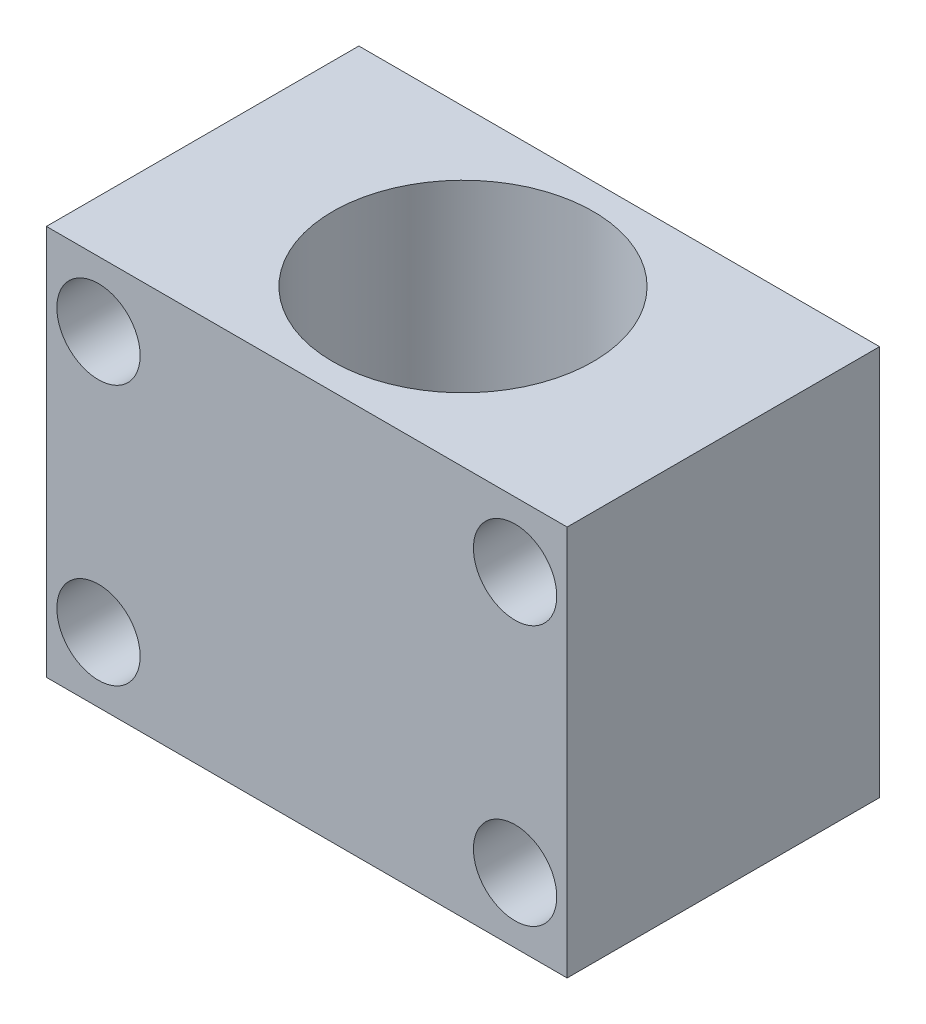
ISO-10303-21;
HEADER;
FILE_DESCRIPTION(('STEP AP214'),'2;1');
FILE_NAME('part.step','',(''),(''),'','','');
FILE_SCHEMA(('AUTOMOTIVE_DESIGN { 1 0 10303 214 1 1 1 1 }'));
ENDSEC;
DATA;
#1=APPLICATION_CONTEXT('core data for automotive mechanical design processes');
#2=APPLICATION_PROTOCOL_DEFINITION('international standard','automotive_design',2000,#1);
#3=PRODUCT_CONTEXT('',#1,'mechanical');
#4=PRODUCT('Part','Part','',(#3));
#5=PRODUCT_RELATED_PRODUCT_CATEGORY('part','',(#4));
#6=PRODUCT_DEFINITION_FORMATION('','',#4);
#7=PRODUCT_DEFINITION_CONTEXT('part definition',#1,'design');
#8=PRODUCT_DEFINITION('design','',#6,#7);
#9=PRODUCT_DEFINITION_SHAPE('','',#8);
#10=(LENGTH_UNIT() NAMED_UNIT(*) SI_UNIT(.MILLI.,.METRE.));
#11=(NAMED_UNIT(*) PLANE_ANGLE_UNIT() SI_UNIT($,.RADIAN.));
#12=(NAMED_UNIT(*) SI_UNIT($,.STERADIAN.) SOLID_ANGLE_UNIT());
#13=UNCERTAINTY_MEASURE_WITH_UNIT(LENGTH_MEASURE(1.E-05),#10,'distance_accuracy_value','');
#14=(GEOMETRIC_REPRESENTATION_CONTEXT(3) GLOBAL_UNCERTAINTY_ASSIGNED_CONTEXT((#13)) GLOBAL_UNIT_ASSIGNED_CONTEXT((#10,
#11,#12)) REPRESENTATION_CONTEXT('',''));
#15=CARTESIAN_POINT('',(0.,0.,0.));
#16=DIRECTION('',(0.,0.,1.));
#17=DIRECTION('',(1.,0.,0.));
#18=AXIS2_PLACEMENT_3D('',#15,#16,#17);
#19=CARTESIAN_POINT('',(-10.,15.,6.));
#20=DIRECTION('',(0.,0.,-1.));
#21=DIRECTION('',(-1.,0.,0.));
#22=AXIS2_PLACEMENT_3D('',#19,#20,#21);
#23=PLANE('',#22);
#24=CARTESIAN_POINT('',(8.,2.5,6.));
#25=DIRECTION('',(0.,0.,1.));
#26=DIRECTION('',(1.,0.,0.));
#27=AXIS2_PLACEMENT_3D('',#24,#25,#26);
#28=CIRCLE('',#27,1.59999999999999);
#29=CARTESIAN_POINT('',(9.59999999999999,2.5,6.));
#30=VERTEX_POINT('',#29);
#31=EDGE_CURVE('E156',#30,#30,#28,.T.);
#32=ORIENTED_EDGE('',*,*,#31,.F.);
#33=EDGE_LOOP('',(#32));
#34=FACE_BOUND('',#33,.T.);
#35=DIRECTION('',(1.,0.,0.));
#36=VECTOR('',#35,1.);
#37=CARTESIAN_POINT('',(-10.,0.,6.));
#38=LINE('',#37,#36);
#39=CARTESIAN_POINT('',(-10.,0.,6.));
#40=VERTEX_POINT('',#39);
#41=CARTESIAN_POINT('',(10.,0.,6.));
#42=VERTEX_POINT('',#41);
#43=EDGE_CURVE('E86',#40,#42,#38,.T.);
#44=ORIENTED_EDGE('',*,*,#43,.T.);
#45=DIRECTION('',(0.,-1.,0.));
#46=VECTOR('',#45,1.);
#47=CARTESIAN_POINT('',(10.,15.,6.));
#48=LINE('',#47,#46);
#49=CARTESIAN_POINT('',(10.,15.,6.));
#50=VERTEX_POINT('',#49);
#51=EDGE_CURVE('E111',#50,#42,#48,.T.);
#52=ORIENTED_EDGE('',*,*,#51,.F.);
#53=DIRECTION('',(1.,0.,0.));
#54=VECTOR('',#53,1.);
#55=CARTESIAN_POINT('',(-10.,15.,6.));
#56=LINE('',#55,#54);
#57=CARTESIAN_POINT('',(-10.,15.,6.));
#58=VERTEX_POINT('',#57);
#59=EDGE_CURVE('E63',#58,#50,#56,.T.);
#60=ORIENTED_EDGE('',*,*,#59,.F.);
#61=DIRECTION('',(0.,-1.,0.));
#62=VECTOR('',#61,1.);
#63=CARTESIAN_POINT('',(-10.,15.,6.));
#64=LINE('',#63,#62);
#65=EDGE_CURVE('E106',#58,#40,#64,.T.);
#66=ORIENTED_EDGE('',*,*,#65,.T.);
#67=EDGE_LOOP('',(#44,#52,#60,#66));
#68=FACE_BOUND('',#67,.T.);
#69=CARTESIAN_POINT('',(8.,12.5,6.));
#70=DIRECTION('',(0.,0.,1.));
#71=DIRECTION('',(1.,0.,0.));
#72=AXIS2_PLACEMENT_3D('',#69,#70,#71);
#73=CIRCLE('',#72,1.59999999999999);
#74=CARTESIAN_POINT('',(9.59999999999999,12.5,6.));
#75=VERTEX_POINT('',#74);
#76=EDGE_CURVE('E148',#75,#75,#73,.T.);
#77=ORIENTED_EDGE('',*,*,#76,.F.);
#78=EDGE_LOOP('',(#77));
#79=FACE_BOUND('',#78,.T.);
#80=CARTESIAN_POINT('',(-8.,2.5,6.));
#81=DIRECTION('',(0.,0.,1.));
#82=DIRECTION('',(1.,0.,0.));
#83=AXIS2_PLACEMENT_3D('',#80,#81,#82);
#84=CIRCLE('',#83,1.59999999999999);
#85=CARTESIAN_POINT('',(-6.40000000000001,2.5,6.));
#86=VERTEX_POINT('',#85);
#87=EDGE_CURVE('E164',#86,#86,#84,.T.);
#88=ORIENTED_EDGE('',*,*,#87,.F.);
#89=EDGE_LOOP('',(#88));
#90=FACE_BOUND('',#89,.T.);
#91=CARTESIAN_POINT('',(-8.,12.5,6.));
#92=DIRECTION('',(0.,0.,1.));
#93=DIRECTION('',(1.,0.,0.));
#94=AXIS2_PLACEMENT_3D('',#91,#92,#93);
#95=CIRCLE('',#94,1.59999999999999);
#96=CARTESIAN_POINT('',(-6.40000000000001,12.5,6.));
#97=VERTEX_POINT('',#96);
#98=EDGE_CURVE('E172',#97,#97,#95,.T.);
#99=ORIENTED_EDGE('',*,*,#98,.F.);
#100=EDGE_LOOP('',(#99));
#101=FACE_BOUND('',#100,.T.);
#102=ADVANCED_FACE('F45',(#34,#68,#79,#90,#101),#23,.F.);
#103=CARTESIAN_POINT('',(0.,15.,0.));
#104=DIRECTION('',(0.,-1.,0.));
#105=DIRECTION('',(0.,0.,-1.));
#106=AXIS2_PLACEMENT_3D('',#103,#104,#105);
#107=PLANE('',#106);
#108=DIRECTION('',(0.,0.,-1.));
#109=VECTOR('',#108,1.);
#110=CARTESIAN_POINT('',(10.,15.,6.));
#111=LINE('',#110,#109);
#112=CARTESIAN_POINT('',(10.,15.,-6.));
#113=VERTEX_POINT('',#112);
#114=EDGE_CURVE('E99',#50,#113,#111,.T.);
#115=ORIENTED_EDGE('',*,*,#114,.T.);
#116=DIRECTION('',(-1.,0.,0.));
#117=VECTOR('',#116,1.);
#118=CARTESIAN_POINT('',(-10.,15.,-6.));
#119=LINE('',#118,#117);
#120=CARTESIAN_POINT('',(-10.,15.,-6.));
#121=VERTEX_POINT('',#120);
#122=EDGE_CURVE('E93',#113,#121,#119,.T.);
#123=ORIENTED_EDGE('',*,*,#122,.T.);
#124=DIRECTION('',(0.,0.,1.));
#125=VECTOR('',#124,1.);
#126=CARTESIAN_POINT('',(-10.,15.,6.));
#127=LINE('',#126,#125);
#128=EDGE_CURVE('E97',#121,#58,#127,.T.);
#129=ORIENTED_EDGE('',*,*,#128,.T.);
#130=ORIENTED_EDGE('',*,*,#59,.T.);
#131=EDGE_LOOP('',(#115,#123,#129,#130));
#132=FACE_BOUND('',#131,.T.);
#133=CARTESIAN_POINT('',(0.,15.,0.));
#134=DIRECTION('',(0.,1.,0.));
#135=DIRECTION('',(0.,0.,1.));
#136=AXIS2_PLACEMENT_3D('',#133,#134,#135);
#137=CIRCLE('',#136,5.);
#138=CARTESIAN_POINT('',(0.,15.,5.));
#139=VERTEX_POINT('',#138);
#140=EDGE_CURVE('E119',#139,#139,#137,.T.);
#141=ORIENTED_EDGE('',*,*,#140,.F.);
#142=EDGE_LOOP('',(#141));
#143=FACE_BOUND('',#142,.T.);
#144=ADVANCED_FACE('F94',(#132,#143),#107,.F.);
#145=CARTESIAN_POINT('',(0.,0.,0.));
#146=DIRECTION('',(0.,-1.,0.));
#147=DIRECTION('',(0.,0.,-1.));
#148=AXIS2_PLACEMENT_3D('',#145,#146,#147);
#149=PLANE('',#148);
#150=DIRECTION('',(0.,0.,-1.));
#151=VECTOR('',#150,1.);
#152=CARTESIAN_POINT('',(10.,0.,6.));
#153=LINE('',#152,#151);
#154=CARTESIAN_POINT('',(10.,0.,-6.));
#155=VERTEX_POINT('',#154);
#156=EDGE_CURVE('E115',#42,#155,#153,.T.);
#157=ORIENTED_EDGE('',*,*,#156,.F.);
#158=ORIENTED_EDGE('',*,*,#43,.F.);
#159=DIRECTION('',(0.,0.,1.));
#160=VECTOR('',#159,1.);
#161=CARTESIAN_POINT('',(-10.,0.,6.));
#162=LINE('',#161,#160);
#163=CARTESIAN_POINT('',(-10.,0.,-6.));
#164=VERTEX_POINT('',#163);
#165=EDGE_CURVE('E80',#164,#40,#162,.T.);
#166=ORIENTED_EDGE('',*,*,#165,.F.);
#167=DIRECTION('',(-1.,0.,0.));
#168=VECTOR('',#167,1.);
#169=CARTESIAN_POINT('',(-10.,0.,-6.));
#170=LINE('',#169,#168);
#171=EDGE_CURVE('E104',#155,#164,#170,.T.);
#172=ORIENTED_EDGE('',*,*,#171,.F.);
#173=EDGE_LOOP('',(#157,#158,#166,#172));
#174=FACE_BOUND('',#173,.T.);
#175=CARTESIAN_POINT('',(0.,0.,0.));
#176=DIRECTION('',(0.,1.,0.));
#177=DIRECTION('',(0.,0.,1.));
#178=AXIS2_PLACEMENT_3D('',#175,#176,#177);
#179=CIRCLE('',#178,5.);
#180=CARTESIAN_POINT('',(0.,0.,5.));
#181=VERTEX_POINT('',#180);
#182=EDGE_CURVE('E137',#181,#181,#179,.T.);
#183=ORIENTED_EDGE('',*,*,#182,.T.);
#184=EDGE_LOOP('',(#183));
#185=FACE_BOUND('',#184,.T.);
#186=ADVANCED_FACE('F132',(#174,#185),#149,.T.);
#187=CARTESIAN_POINT('',(10.,15.,6.));
#188=DIRECTION('',(-1.,0.,0.));
#189=DIRECTION('',(0.,0.,1.));
#190=AXIS2_PLACEMENT_3D('',#187,#188,#189);
#191=PLANE('',#190);
#192=ORIENTED_EDGE('',*,*,#156,.T.);
#193=DIRECTION('',(0.,-1.,0.));
#194=VECTOR('',#193,1.);
#195=CARTESIAN_POINT('',(10.,15.,-6.));
#196=LINE('',#195,#194);
#197=EDGE_CURVE('E11',#113,#155,#196,.T.);
#198=ORIENTED_EDGE('',*,*,#197,.F.);
#199=ORIENTED_EDGE('',*,*,#114,.F.);
#200=ORIENTED_EDGE('',*,*,#51,.T.);
#201=EDGE_LOOP('',(#192,#198,#199,#200));
#202=FACE_BOUND('',#201,.T.);
#203=ADVANCED_FACE('F47',(#202),#191,.F.);
#204=CARTESIAN_POINT('',(-10.,15.,-6.));
#205=DIRECTION('',(0.,0.,1.));
#206=DIRECTION('',(1.,0.,0.));
#207=AXIS2_PLACEMENT_3D('',#204,#205,#206);
#208=PLANE('',#207);
#209=CARTESIAN_POINT('',(-8.,12.5,-5.99999999999999));
#210=DIRECTION('',(0.,0.,1.));
#211=DIRECTION('',(1.,0.,0.));
#212=AXIS2_PLACEMENT_3D('',#209,#210,#211);
#213=CIRCLE('',#212,1.59999999999999);
#214=CARTESIAN_POINT('',(-6.40000000000001,12.5,-5.99999999999999));
#215=VERTEX_POINT('',#214);
#216=EDGE_CURVE('E168',#215,#215,#213,.T.);
#217=ORIENTED_EDGE('',*,*,#216,.T.);
#218=EDGE_LOOP('',(#217));
#219=FACE_BOUND('',#218,.T.);
#220=CARTESIAN_POINT('',(-8.,2.5,-5.99999999999999));
#221=DIRECTION('',(0.,0.,1.));
#222=DIRECTION('',(1.,0.,0.));
#223=AXIS2_PLACEMENT_3D('',#220,#221,#222);
#224=CIRCLE('',#223,1.59999999999999);
#225=CARTESIAN_POINT('',(-6.40000000000001,2.5,-5.99999999999999));
#226=VERTEX_POINT('',#225);
#227=EDGE_CURVE('E160',#226,#226,#224,.T.);
#228=ORIENTED_EDGE('',*,*,#227,.T.);
#229=EDGE_LOOP('',(#228));
#230=FACE_BOUND('',#229,.T.);
#231=CARTESIAN_POINT('',(8.,2.5,-6.));
#232=DIRECTION('',(0.,0.,1.));
#233=DIRECTION('',(1.,0.,0.));
#234=AXIS2_PLACEMENT_3D('',#231,#232,#233);
#235=CIRCLE('',#234,1.59999999999999);
#236=CARTESIAN_POINT('',(9.59999999999999,2.5,-6.));
#237=VERTEX_POINT('',#236);
#238=EDGE_CURVE('E152',#237,#237,#235,.T.);
#239=ORIENTED_EDGE('',*,*,#238,.T.);
#240=EDGE_LOOP('',(#239));
#241=FACE_BOUND('',#240,.T.);
#242=CARTESIAN_POINT('',(8.,12.5,-6.));
#243=DIRECTION('',(0.,0.,1.));
#244=DIRECTION('',(1.,0.,0.));
#245=AXIS2_PLACEMENT_3D('',#242,#243,#244);
#246=CIRCLE('',#245,1.59999999999999);
#247=CARTESIAN_POINT('',(9.59999999999999,12.5,-6.));
#248=VERTEX_POINT('',#247);
#249=EDGE_CURVE('E141',#248,#248,#246,.T.);
#250=ORIENTED_EDGE('',*,*,#249,.T.);
#251=EDGE_LOOP('',(#250));
#252=FACE_BOUND('',#251,.T.);
#253=ORIENTED_EDGE('',*,*,#171,.T.);
#254=DIRECTION('',(0.,-1.,0.));
#255=VECTOR('',#254,1.);
#256=CARTESIAN_POINT('',(-10.,15.,-6.));
#257=LINE('',#256,#255);
#258=EDGE_CURVE('E55',#121,#164,#257,.T.);
#259=ORIENTED_EDGE('',*,*,#258,.F.);
#260=ORIENTED_EDGE('',*,*,#122,.F.);
#261=ORIENTED_EDGE('',*,*,#197,.T.);
#262=EDGE_LOOP('',(#253,#259,#260,#261));
#263=FACE_BOUND('',#262,.T.);
#264=ADVANCED_FACE('F103',(#219,#230,#241,#252,#263),#208,.F.);
#265=CARTESIAN_POINT('',(-10.,15.,6.));
#266=DIRECTION('',(1.,0.,0.));
#267=DIRECTION('',(0.,0.,-1.));
#268=AXIS2_PLACEMENT_3D('',#265,#266,#267);
#269=PLANE('',#268);
#270=ORIENTED_EDGE('',*,*,#165,.T.);
#271=ORIENTED_EDGE('',*,*,#65,.F.);
#272=ORIENTED_EDGE('',*,*,#128,.F.);
#273=ORIENTED_EDGE('',*,*,#258,.T.);
#274=EDGE_LOOP('',(#270,#271,#272,#273));
#275=FACE_BOUND('',#274,.T.);
#276=ADVANCED_FACE('F107',(#275),#269,.F.);
#277=CARTESIAN_POINT('',(0.,15.,0.));
#278=DIRECTION('',(0.,-1.,0.));
#279=DIRECTION('',(0.,0.,-1.));
#280=AXIS2_PLACEMENT_3D('',#277,#278,#279);
#281=CYLINDRICAL_SURFACE('',#280,5.);
#282=ORIENTED_EDGE('',*,*,#140,.T.);
#283=EDGE_LOOP('',(#282));
#284=FACE_BOUND('',#283,.T.);
#285=ORIENTED_EDGE('',*,*,#182,.F.);
#286=EDGE_LOOP('',(#285));
#287=FACE_BOUND('',#286,.T.);
#288=ADVANCED_FACE('F192',(#284,#287),#281,.F.);
#289=CARTESIAN_POINT('',(8.,12.5,6.));
#290=DIRECTION('',(0.,0.,1.));
#291=DIRECTION('',(1.,0.,0.));
#292=AXIS2_PLACEMENT_3D('',#289,#290,#291);
#293=CYLINDRICAL_SURFACE('',#292,1.59999999999999);
#294=ORIENTED_EDGE('',*,*,#249,.F.);
#295=EDGE_LOOP('',(#294));
#296=FACE_BOUND('',#295,.T.);
#297=ORIENTED_EDGE('',*,*,#76,.T.);
#298=EDGE_LOOP('',(#297));
#299=FACE_BOUND('',#298,.T.);
#300=ADVANCED_FACE('F206',(#296,#299),#293,.F.);
#301=CARTESIAN_POINT('',(8.,2.5,6.));
#302=DIRECTION('',(0.,0.,1.));
#303=DIRECTION('',(1.,0.,0.));
#304=AXIS2_PLACEMENT_3D('',#301,#302,#303);
#305=CYLINDRICAL_SURFACE('',#304,1.59999999999999);
#306=ORIENTED_EDGE('',*,*,#238,.F.);
#307=EDGE_LOOP('',(#306));
#308=FACE_BOUND('',#307,.T.);
#309=ORIENTED_EDGE('',*,*,#31,.T.);
#310=EDGE_LOOP('',(#309));
#311=FACE_BOUND('',#310,.T.);
#312=ADVANCED_FACE('F208',(#308,#311),#305,.F.);
#313=CARTESIAN_POINT('',(-8.,2.5,6.));
#314=DIRECTION('',(0.,0.,1.));
#315=DIRECTION('',(1.,0.,0.));
#316=AXIS2_PLACEMENT_3D('',#313,#314,#315);
#317=CYLINDRICAL_SURFACE('',#316,1.59999999999999);
#318=ORIENTED_EDGE('',*,*,#227,.F.);
#319=EDGE_LOOP('',(#318));
#320=FACE_BOUND('',#319,.T.);
#321=ORIENTED_EDGE('',*,*,#87,.T.);
#322=EDGE_LOOP('',(#321));
#323=FACE_BOUND('',#322,.T.);
#324=ADVANCED_FACE('F214',(#320,#323),#317,.F.);
#325=CARTESIAN_POINT('',(-8.,12.5,6.));
#326=DIRECTION('',(0.,0.,1.));
#327=DIRECTION('',(1.,0.,0.));
#328=AXIS2_PLACEMENT_3D('',#325,#326,#327);
#329=CYLINDRICAL_SURFACE('',#328,1.59999999999999);
#330=ORIENTED_EDGE('',*,*,#216,.F.);
#331=EDGE_LOOP('',(#330));
#332=FACE_BOUND('',#331,.T.);
#333=ORIENTED_EDGE('',*,*,#98,.T.);
#334=EDGE_LOOP('',(#333));
#335=FACE_BOUND('',#334,.T.);
#336=ADVANCED_FACE('F177',(#332,#335),#329,.F.);
#337=CLOSED_SHELL('',(#102,#144,#186,#203,#264,#276,#288,#300,#312,#324,#336));
#338=MANIFOLD_SOLID_BREP('B2',#337);
#339=ADVANCED_BREP_SHAPE_REPRESENTATION('',(#18,#338),#14);
#340=SHAPE_DEFINITION_REPRESENTATION(#9,#339);
ENDSEC;
END-ISO-10303-21;
